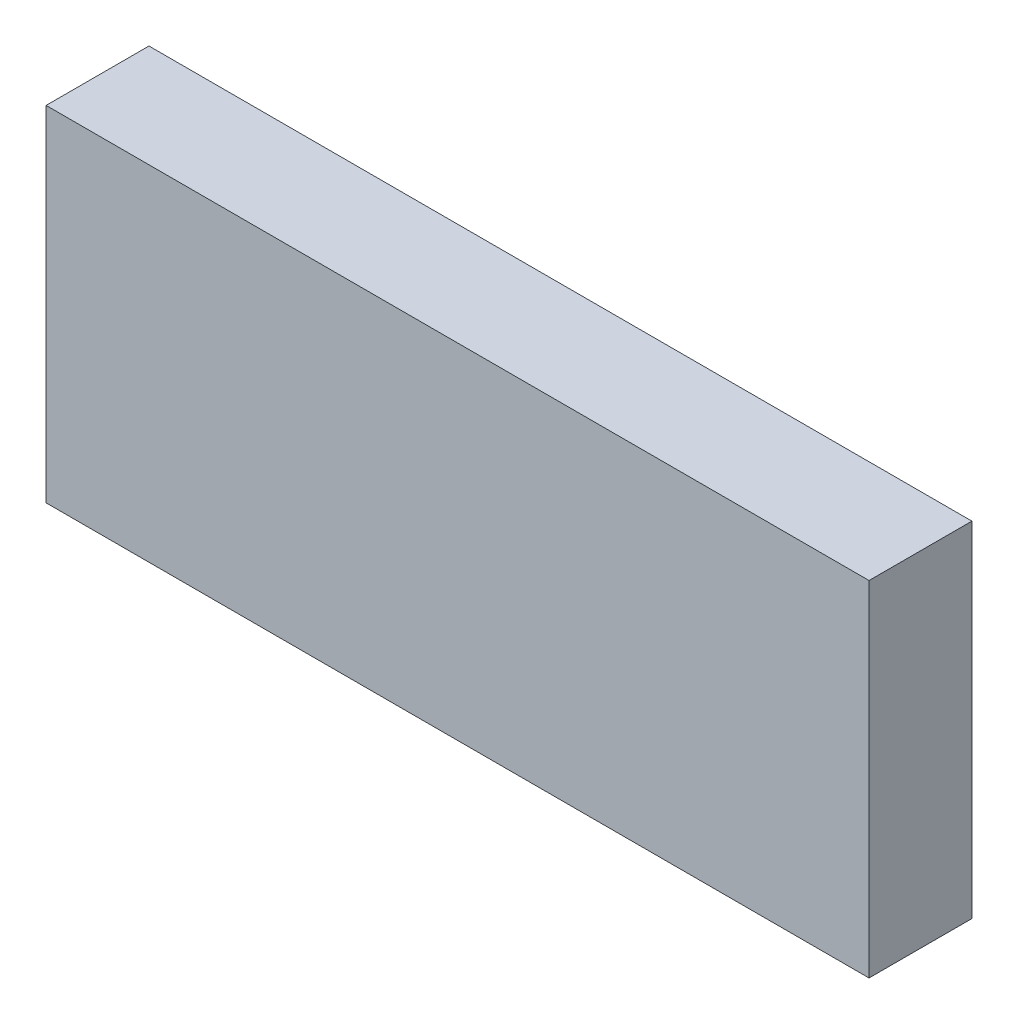
ISO-10303-21;
HEADER;
FILE_DESCRIPTION(('STEP AP214'),'2;1');
FILE_NAME('part.step','',(''),(''),'','','');
FILE_SCHEMA(('AUTOMOTIVE_DESIGN { 1 0 10303 214 1 1 1 1 }'));
ENDSEC;
DATA;
#1=APPLICATION_CONTEXT('core data for automotive mechanical design processes');
#2=APPLICATION_PROTOCOL_DEFINITION('international standard','automotive_design',2000,#1);
#3=PRODUCT_CONTEXT('',#1,'mechanical');
#4=PRODUCT('Part','Part','',(#3));
#5=PRODUCT_RELATED_PRODUCT_CATEGORY('part','',(#4));
#6=PRODUCT_DEFINITION_FORMATION('','',#4);
#7=PRODUCT_DEFINITION_CONTEXT('part definition',#1,'design');
#8=PRODUCT_DEFINITION('design','',#6,#7);
#9=PRODUCT_DEFINITION_SHAPE('','',#8);
#10=(LENGTH_UNIT() NAMED_UNIT(*) SI_UNIT(.MILLI.,.METRE.));
#11=(NAMED_UNIT(*) PLANE_ANGLE_UNIT() SI_UNIT($,.RADIAN.));
#12=(NAMED_UNIT(*) SI_UNIT($,.STERADIAN.) SOLID_ANGLE_UNIT());
#13=UNCERTAINTY_MEASURE_WITH_UNIT(LENGTH_MEASURE(1.E-05),#10,'distance_accuracy_value','');
#14=(GEOMETRIC_REPRESENTATION_CONTEXT(3) GLOBAL_UNCERTAINTY_ASSIGNED_CONTEXT((#13)) GLOBAL_UNIT_ASSIGNED_CONTEXT((#10,
#11,#12)) REPRESENTATION_CONTEXT('',''));
#15=CARTESIAN_POINT('',(0.,0.,0.));
#16=DIRECTION('',(0.,0.,1.));
#17=DIRECTION('',(1.,0.,0.));
#18=AXIS2_PLACEMENT_3D('',#15,#16,#17);
#19=CARTESIAN_POINT('',(-5.97575757575758,5.95,2.54));
#20=DIRECTION('',(1.,0.,0.));
#21=DIRECTION('',(0.,0.,-1.));
#22=AXIS2_PLACEMENT_3D('',#19,#20,#21);
#23=PLANE('',#22);
#24=DIRECTION('',(0.,-1.,0.));
#25=VECTOR('',#24,1.);
#26=CARTESIAN_POINT('',(-5.97575757575758,5.95,0.));
#27=LINE('',#26,#25);
#28=CARTESIAN_POINT('',(-5.97575757575758,5.95,0.));
#29=VERTEX_POINT('',#28);
#30=CARTESIAN_POINT('',(-5.97575757575758,-2.55,0.));
#31=VERTEX_POINT('',#30);
#32=EDGE_CURVE('E104',#29,#31,#27,.T.);
#33=ORIENTED_EDGE('',*,*,#32,.T.);
#34=DIRECTION('',(0.,0.,-1.));
#35=VECTOR('',#34,1.);
#36=CARTESIAN_POINT('',(-5.97575757575758,-2.55,2.54));
#37=LINE('',#36,#35);
#38=CARTESIAN_POINT('',(-5.97575757575758,-2.55,2.54));
#39=VERTEX_POINT('',#38);
#40=EDGE_CURVE('E11',#39,#31,#37,.T.);
#41=ORIENTED_EDGE('',*,*,#40,.F.);
#42=DIRECTION('',(0.,-1.,0.));
#43=VECTOR('',#42,1.);
#44=CARTESIAN_POINT('',(-5.97575757575758,5.95,2.54));
#45=LINE('',#44,#43);
#46=CARTESIAN_POINT('',(-5.97575757575758,5.95,2.54));
#47=VERTEX_POINT('',#46);
#48=EDGE_CURVE('E92',#47,#39,#45,.T.);
#49=ORIENTED_EDGE('',*,*,#48,.F.);
#50=DIRECTION('',(0.,0.,-1.));
#51=VECTOR('',#50,1.);
#52=CARTESIAN_POINT('',(-5.97575757575758,5.95,2.54));
#53=LINE('',#52,#51);
#54=EDGE_CURVE('E100',#47,#29,#53,.T.);
#55=ORIENTED_EDGE('',*,*,#54,.T.);
#56=EDGE_LOOP('',(#33,#41,#49,#55));
#57=FACE_BOUND('',#56,.T.);
#58=ADVANCED_FACE('F41',(#57),#23,.F.);
#59=CARTESIAN_POINT('',(-5.97575757575758,-2.55,2.54));
#60=DIRECTION('',(0.,1.,0.));
#61=DIRECTION('',(0.,0.,1.));
#62=AXIS2_PLACEMENT_3D('',#59,#60,#61);
#63=PLANE('',#62);
#64=DIRECTION('',(1.,0.,0.));
#65=VECTOR('',#64,1.);
#66=CARTESIAN_POINT('',(-5.97575757575758,-2.55,0.));
#67=LINE('',#66,#65);
#68=CARTESIAN_POINT('',(14.3442424242424,-2.55,0.));
#69=VERTEX_POINT('',#68);
#70=EDGE_CURVE('E96',#31,#69,#67,.T.);
#71=ORIENTED_EDGE('',*,*,#70,.T.);
#72=DIRECTION('',(0.,0.,-1.));
#73=VECTOR('',#72,1.);
#74=CARTESIAN_POINT('',(14.3442424242424,-2.55,2.54));
#75=LINE('',#74,#73);
#76=CARTESIAN_POINT('',(14.3442424242424,-2.55,2.54));
#77=VERTEX_POINT('',#76);
#78=EDGE_CURVE('E49',#77,#69,#75,.T.);
#79=ORIENTED_EDGE('',*,*,#78,.F.);
#80=DIRECTION('',(1.,0.,0.));
#81=VECTOR('',#80,1.);
#82=CARTESIAN_POINT('',(-5.97575757575758,-2.55,2.54));
#83=LINE('',#82,#81);
#84=EDGE_CURVE('E87',#39,#77,#83,.T.);
#85=ORIENTED_EDGE('',*,*,#84,.F.);
#86=ORIENTED_EDGE('',*,*,#40,.T.);
#87=EDGE_LOOP('',(#71,#79,#85,#86));
#88=FACE_BOUND('',#87,.T.);
#89=ADVANCED_FACE('F95',(#88),#63,.F.);
#90=CARTESIAN_POINT('',(14.3442424242424,5.95,2.54));
#91=DIRECTION('',(-1.,0.,0.));
#92=DIRECTION('',(0.,0.,1.));
#93=AXIS2_PLACEMENT_3D('',#90,#91,#92);
#94=PLANE('',#93);
#95=DIRECTION('',(0.,1.,0.));
#96=VECTOR('',#95,1.);
#97=CARTESIAN_POINT('',(14.3442424242424,5.95,0.));
#98=LINE('',#97,#96);
#99=CARTESIAN_POINT('',(14.3442424242424,5.95,0.));
#100=VERTEX_POINT('',#99);
#101=EDGE_CURVE('E74',#69,#100,#98,.T.);
#102=ORIENTED_EDGE('',*,*,#101,.T.);
#103=DIRECTION('',(0.,0.,-1.));
#104=VECTOR('',#103,1.);
#105=CARTESIAN_POINT('',(14.3442424242424,5.95,2.54));
#106=LINE('',#105,#104);
#107=CARTESIAN_POINT('',(14.3442424242424,5.95,2.54));
#108=VERTEX_POINT('',#107);
#109=EDGE_CURVE('E97',#108,#100,#106,.T.);
#110=ORIENTED_EDGE('',*,*,#109,.F.);
#111=DIRECTION('',(0.,1.,0.));
#112=VECTOR('',#111,1.);
#113=CARTESIAN_POINT('',(14.3442424242424,5.95,2.54));
#114=LINE('',#113,#112);
#115=EDGE_CURVE('E90',#77,#108,#114,.T.);
#116=ORIENTED_EDGE('',*,*,#115,.F.);
#117=ORIENTED_EDGE('',*,*,#78,.T.);
#118=EDGE_LOOP('',(#102,#110,#116,#117));
#119=FACE_BOUND('',#118,.T.);
#120=ADVANCED_FACE('F98',(#119),#94,.F.);
#121=CARTESIAN_POINT('',(-5.97575757575758,5.95,2.54));
#122=DIRECTION('',(0.,-1.,0.));
#123=DIRECTION('',(0.,0.,-1.));
#124=AXIS2_PLACEMENT_3D('',#121,#122,#123);
#125=PLANE('',#124);
#126=DIRECTION('',(-1.,0.,0.));
#127=VECTOR('',#126,1.);
#128=CARTESIAN_POINT('',(-5.97575757575758,5.95,0.));
#129=LINE('',#128,#127);
#130=EDGE_CURVE('E80',#100,#29,#129,.T.);
#131=ORIENTED_EDGE('',*,*,#130,.T.);
#132=ORIENTED_EDGE('',*,*,#54,.F.);
#133=DIRECTION('',(-1.,0.,0.));
#134=VECTOR('',#133,1.);
#135=CARTESIAN_POINT('',(-5.97575757575758,5.95,2.54));
#136=LINE('',#135,#134);
#137=EDGE_CURVE('E57',#108,#47,#136,.T.);
#138=ORIENTED_EDGE('',*,*,#137,.F.);
#139=ORIENTED_EDGE('',*,*,#109,.T.);
#140=EDGE_LOOP('',(#131,#132,#138,#139));
#141=FACE_BOUND('',#140,.T.);
#142=ADVANCED_FACE('F111',(#141),#125,.F.);
#143=CARTESIAN_POINT('',(0.,0.,2.54));
#144=DIRECTION('',(0.,0.,1.));
#145=DIRECTION('',(1.,0.,0.));
#146=AXIS2_PLACEMENT_3D('',#143,#144,#145);
#147=PLANE('',#146);
#148=ORIENTED_EDGE('',*,*,#48,.T.);
#149=ORIENTED_EDGE('',*,*,#84,.T.);
#150=ORIENTED_EDGE('',*,*,#115,.T.);
#151=ORIENTED_EDGE('',*,*,#137,.T.);
#152=EDGE_LOOP('',(#148,#149,#150,#151));
#153=FACE_BOUND('',#152,.T.);
#154=ADVANCED_FACE('F88',(#153),#147,.T.);
#155=CARTESIAN_POINT('',(0.,0.,0.));
#156=DIRECTION('',(0.,0.,1.));
#157=DIRECTION('',(1.,0.,0.));
#158=AXIS2_PLACEMENT_3D('',#155,#156,#157);
#159=PLANE('',#158);
#160=ORIENTED_EDGE('',*,*,#32,.F.);
#161=ORIENTED_EDGE('',*,*,#130,.F.);
#162=ORIENTED_EDGE('',*,*,#101,.F.);
#163=ORIENTED_EDGE('',*,*,#70,.F.);
#164=EDGE_LOOP('',(#160,#161,#162,#163));
#165=FACE_BOUND('',#164,.T.);
#166=ADVANCED_FACE('F114',(#165),#159,.F.);
#167=CLOSED_SHELL('',(#58,#89,#120,#142,#154,#166));
#168=MANIFOLD_SOLID_BREP('B2',#167);
#169=ADVANCED_BREP_SHAPE_REPRESENTATION('',(#18,#168),#14);
#170=SHAPE_DEFINITION_REPRESENTATION(#9,#169);
ENDSEC;
END-ISO-10303-21;
